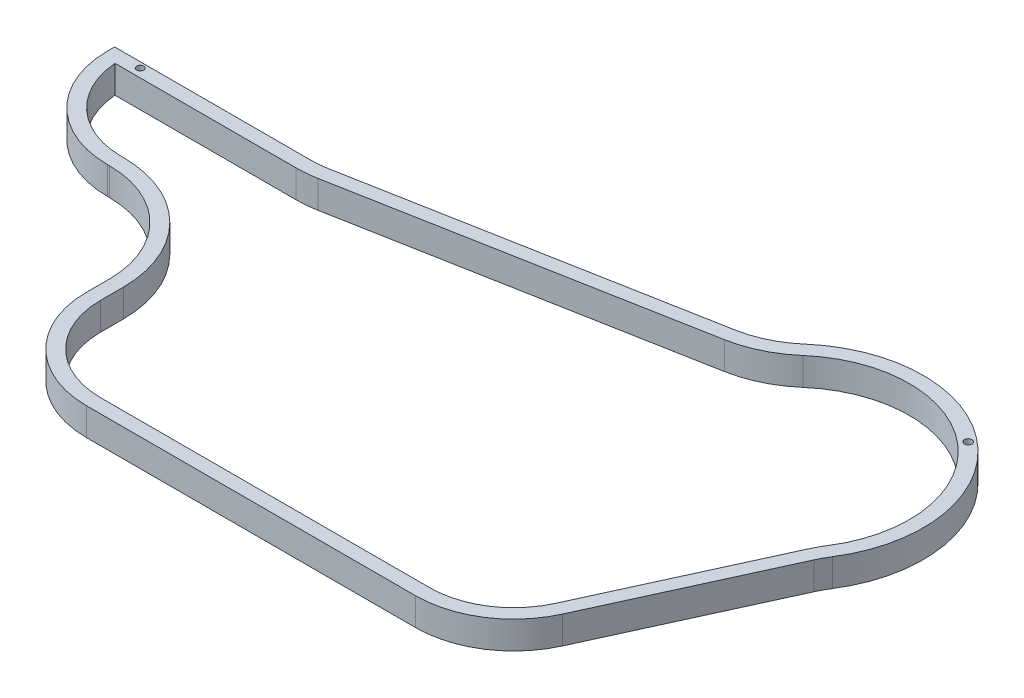
ISO-10303-21;
HEADER;
FILE_DESCRIPTION(('STEP AP214'),'2;1');
FILE_NAME('part.step','',(''),(''),'','','');
FILE_SCHEMA(('AUTOMOTIVE_DESIGN { 1 0 10303 214 1 1 1 1 }'));
ENDSEC;
DATA;
#1=APPLICATION_CONTEXT('core data for automotive mechanical design processes');
#2=APPLICATION_PROTOCOL_DEFINITION('international standard','automotive_design',2000,#1);
#3=PRODUCT_CONTEXT('',#1,'mechanical');
#4=PRODUCT('Part','Part','',(#3));
#5=PRODUCT_RELATED_PRODUCT_CATEGORY('part','',(#4));
#6=PRODUCT_DEFINITION_FORMATION('','',#4);
#7=PRODUCT_DEFINITION_CONTEXT('part definition',#1,'design');
#8=PRODUCT_DEFINITION('design','',#6,#7);
#9=PRODUCT_DEFINITION_SHAPE('','',#8);
#10=(LENGTH_UNIT() NAMED_UNIT(*) SI_UNIT(.MILLI.,.METRE.));
#11=(NAMED_UNIT(*) PLANE_ANGLE_UNIT() SI_UNIT($,.RADIAN.));
#12=(NAMED_UNIT(*) SI_UNIT($,.STERADIAN.) SOLID_ANGLE_UNIT());
#13=UNCERTAINTY_MEASURE_WITH_UNIT(LENGTH_MEASURE(1.E-05),#10,'distance_accuracy_value','');
#14=(GEOMETRIC_REPRESENTATION_CONTEXT(3) GLOBAL_UNCERTAINTY_ASSIGNED_CONTEXT((#13)) GLOBAL_UNIT_ASSIGNED_CONTEXT((#10,
#11,#12)) REPRESENTATION_CONTEXT('',''));
#15=CARTESIAN_POINT('',(0.,0.,0.));
#16=DIRECTION('',(0.,0.,1.));
#17=DIRECTION('',(1.,0.,0.));
#18=AXIS2_PLACEMENT_3D('',#15,#16,#17);
#19=CARTESIAN_POINT('',(-35.8905464193308,5.,-25.0792929292929));
#20=DIRECTION('',(1.,0.,0.));
#21=DIRECTION('',(0.,0.,-1.));
#22=AXIS2_PLACEMENT_3D('',#19,#20,#21);
#23=PLANE('',#22);
#24=DIRECTION('',(0.,0.,1.));
#25=VECTOR('',#24,1.);
#26=CARTESIAN_POINT('',(-35.8905464193308,0.,-25.0792929292929));
#27=LINE('',#26,#25);
#28=CARTESIAN_POINT('',(-35.8905464193308,0.,-25.0792929292929));
#29=VERTEX_POINT('',#28);
#30=CARTESIAN_POINT('',(-35.8905464193308,0.,-23.7772222222223));
#31=VERTEX_POINT('',#30);
#32=EDGE_CURVE('E306',#29,#31,#27,.T.);
#33=ORIENTED_EDGE('',*,*,#32,.T.);
#34=DIRECTION('',(0.,-1.,0.));
#35=VECTOR('',#34,1.);
#36=CARTESIAN_POINT('',(-35.8905464193308,5.,-23.7772222222223));
#37=LINE('',#36,#35);
#38=CARTESIAN_POINT('',(-35.8905464193308,5.,-23.7772222222223));
#39=VERTEX_POINT('',#38);
#40=EDGE_CURVE('E488',#39,#31,#37,.T.);
#41=ORIENTED_EDGE('',*,*,#40,.F.);
#42=DIRECTION('',(0.,0.,1.));
#43=VECTOR('',#42,1.);
#44=CARTESIAN_POINT('',(-35.8905464193308,5.,-25.0792929292929));
#45=LINE('',#44,#43);
#46=CARTESIAN_POINT('',(-35.8905464193308,5.,-25.0792929292929));
#47=VERTEX_POINT('',#46);
#48=EDGE_CURVE('E341',#47,#39,#45,.T.);
#49=ORIENTED_EDGE('',*,*,#48,.F.);
#50=DIRECTION('',(0.,-1.,0.));
#51=VECTOR('',#50,1.);
#52=CARTESIAN_POINT('',(-35.8905464193308,5.,-25.0792929292929));
#53=LINE('',#52,#51);
#54=EDGE_CURVE('E388',#47,#29,#53,.T.);
#55=ORIENTED_EDGE('',*,*,#54,.T.);
#56=EDGE_LOOP('',(#33,#41,#49,#55));
#57=FACE_BOUND('',#56,.T.);
#58=ADVANCED_FACE('F41',(#57),#23,.F.);
#59=CARTESIAN_POINT('',(-18.1105464193308,5.,-23.7772222222222));
#60=DIRECTION('',(0.,-1.,0.));
#61=DIRECTION('',(0.,0.,-1.));
#62=AXIS2_PLACEMENT_3D('',#59,#60,#61);
#63=CYLINDRICAL_SURFACE('',#62,17.78);
#64=CARTESIAN_POINT('',(-18.1105464193308,0.,-23.7772222222222));
#65=DIRECTION('',(0.,1.,0.));
#66=DIRECTION('',(0.,0.,1.));
#67=AXIS2_PLACEMENT_3D('',#64,#65,#66);
#68=CIRCLE('',#67,17.78);
#69=CARTESIAN_POINT('',(-18.1105464193307,0.,-5.99722222222222));
#70=VERTEX_POINT('',#69);
#71=EDGE_CURVE('E392',#31,#70,#68,.T.);
#72=ORIENTED_EDGE('',*,*,#71,.T.);
#73=DIRECTION('',(0.,-1.,0.));
#74=VECTOR('',#73,1.);
#75=CARTESIAN_POINT('',(-18.1105464193307,5.,-5.99722222222222));
#76=LINE('',#75,#74);
#77=CARTESIAN_POINT('',(-18.1105464193307,5.,-5.99722222222222));
#78=VERTEX_POINT('',#77);
#79=EDGE_CURVE('E484',#78,#70,#76,.T.);
#80=ORIENTED_EDGE('',*,*,#79,.F.);
#81=CARTESIAN_POINT('',(-18.1105464193308,5.,-23.7772222222222));
#82=DIRECTION('',(0.,1.,0.));
#83=DIRECTION('',(0.,0.,1.));
#84=AXIS2_PLACEMENT_3D('',#81,#82,#83);
#85=CIRCLE('',#84,17.78);
#86=EDGE_CURVE('E345',#39,#78,#85,.T.);
#87=ORIENTED_EDGE('',*,*,#86,.F.);
#88=ORIENTED_EDGE('',*,*,#40,.T.);
#89=EDGE_LOOP('',(#72,#80,#87,#88));
#90=FACE_BOUND('',#89,.T.);
#91=ADVANCED_FACE('F579',(#90),#63,.T.);
#92=CARTESIAN_POINT('',(-18.1105464193307,5.,-5.99722222222222));
#93=DIRECTION('',(0.,0.,-1.));
#94=DIRECTION('',(-1.,0.,0.));
#95=AXIS2_PLACEMENT_3D('',#92,#93,#94);
#96=PLANE('',#95);
#97=DIRECTION('',(1.,0.,0.));
#98=VECTOR('',#97,1.);
#99=CARTESIAN_POINT('',(-18.1105464193307,0.,-5.99722222222222));
#100=LINE('',#99,#98);
#101=CARTESIAN_POINT('',(-17.7800000000001,0.,-5.99722222222222));
#102=VERTEX_POINT('',#101);
#103=EDGE_CURVE('E395',#70,#102,#100,.T.);
#104=ORIENTED_EDGE('',*,*,#103,.T.);
#105=DIRECTION('',(0.,-1.,0.));
#106=VECTOR('',#105,1.);
#107=CARTESIAN_POINT('',(-17.7800000000001,5.,-5.99722222222222));
#108=LINE('',#107,#106);
#109=CARTESIAN_POINT('',(-17.7800000000001,5.,-5.99722222222222));
#110=VERTEX_POINT('',#109);
#111=EDGE_CURVE('E480',#110,#102,#108,.T.);
#112=ORIENTED_EDGE('',*,*,#111,.F.);
#113=DIRECTION('',(1.,0.,0.));
#114=VECTOR('',#113,1.);
#115=CARTESIAN_POINT('',(-18.1105464193307,5.,-5.99722222222222));
#116=LINE('',#115,#114);
#117=EDGE_CURVE('E349',#78,#110,#116,.T.);
#118=ORIENTED_EDGE('',*,*,#117,.F.);
#119=ORIENTED_EDGE('',*,*,#79,.T.);
#120=EDGE_LOOP('',(#104,#112,#118,#119));
#121=FACE_BOUND('',#120,.T.);
#122=ADVANCED_FACE('F584',(#121),#96,.F.);
#123=CARTESIAN_POINT('',(-17.78,5.,11.7827777777778));
#124=DIRECTION('',(0.,-1.,0.));
#125=DIRECTION('',(0.,0.,-1.));
#126=AXIS2_PLACEMENT_3D('',#123,#124,#125);
#127=CYLINDRICAL_SURFACE('',#126,17.78);
#128=CARTESIAN_POINT('',(-17.78,0.,11.7827777777778));
#129=DIRECTION('',(0.,-1.,0.));
#130=DIRECTION('',(0.,0.,-1.));
#131=AXIS2_PLACEMENT_3D('',#128,#129,#130);
#132=CIRCLE('',#131,17.78);
#133=CARTESIAN_POINT('',(0.,0.,11.7827777777779));
#134=VERTEX_POINT('',#133);
#135=EDGE_CURVE('E398',#102,#134,#132,.T.);
#136=ORIENTED_EDGE('',*,*,#135,.T.);
#137=DIRECTION('',(0.,-1.,0.));
#138=VECTOR('',#137,1.);
#139=CARTESIAN_POINT('',(0.,5.,11.7827777777779));
#140=LINE('',#139,#138);
#141=CARTESIAN_POINT('',(0.,5.,11.7827777777779));
#142=VERTEX_POINT('',#141);
#143=EDGE_CURVE('E476',#142,#134,#140,.T.);
#144=ORIENTED_EDGE('',*,*,#143,.F.);
#145=CARTESIAN_POINT('',(-17.78,5.,11.7827777777778));
#146=DIRECTION('',(0.,-1.,0.));
#147=DIRECTION('',(0.,0.,-1.));
#148=AXIS2_PLACEMENT_3D('',#145,#146,#147);
#149=CIRCLE('',#148,17.78);
#150=EDGE_CURVE('E352',#110,#142,#149,.T.);
#151=ORIENTED_EDGE('',*,*,#150,.F.);
#152=ORIENTED_EDGE('',*,*,#111,.T.);
#153=EDGE_LOOP('',(#136,#144,#151,#152));
#154=FACE_BOUND('',#153,.T.);
#155=ADVANCED_FACE('F648',(#154),#127,.F.);
#156=CARTESIAN_POINT('',(0.,5.,11.7827777777779));
#157=DIRECTION('',(1.,0.,0.));
#158=DIRECTION('',(0.,0.,-1.));
#159=AXIS2_PLACEMENT_3D('',#156,#157,#158);
#160=PLANE('',#159);
#161=DIRECTION('',(0.,0.,1.));
#162=VECTOR('',#161,1.);
#163=CARTESIAN_POINT('',(0.,0.,11.7827777777779));
#164=LINE('',#163,#162);
#165=CARTESIAN_POINT('',(0.,0.,15.9134848484847));
#166=VERTEX_POINT('',#165);
#167=EDGE_CURVE('E401',#134,#166,#164,.T.);
#168=ORIENTED_EDGE('',*,*,#167,.T.);
#169=DIRECTION('',(0.,-1.,0.));
#170=VECTOR('',#169,1.);
#171=CARTESIAN_POINT('',(0.,5.,15.9134848484847));
#172=LINE('',#171,#170);
#173=CARTESIAN_POINT('',(0.,5.,15.9134848484847));
#174=VERTEX_POINT('',#173);
#175=EDGE_CURVE('E472',#174,#166,#172,.T.);
#176=ORIENTED_EDGE('',*,*,#175,.F.);
#177=DIRECTION('',(0.,0.,1.));
#178=VECTOR('',#177,1.);
#179=CARTESIAN_POINT('',(0.,5.,11.7827777777779));
#180=LINE('',#179,#178);
#181=EDGE_CURVE('E355',#142,#174,#180,.T.);
#182=ORIENTED_EDGE('',*,*,#181,.F.);
#183=ORIENTED_EDGE('',*,*,#143,.T.);
#184=EDGE_LOOP('',(#168,#176,#182,#183));
#185=FACE_BOUND('',#184,.T.);
#186=ADVANCED_FACE('F645',(#185),#160,.F.);
#187=CARTESIAN_POINT('',(17.78,5.,15.9134848484849));
#188=DIRECTION('',(0.,-1.,0.));
#189=DIRECTION('',(0.,0.,-1.));
#190=AXIS2_PLACEMENT_3D('',#187,#188,#189);
#191=CYLINDRICAL_SURFACE('',#190,17.78);
#192=CARTESIAN_POINT('',(17.78,0.,15.9134848484849));
#193=DIRECTION('',(0.,1.,0.));
#194=DIRECTION('',(0.,0.,1.));
#195=AXIS2_PLACEMENT_3D('',#192,#193,#194);
#196=CIRCLE('',#195,17.78);
#197=CARTESIAN_POINT('',(17.7800000000001,0.,33.6934848484849));
#198=VERTEX_POINT('',#197);
#199=EDGE_CURVE('E404',#166,#198,#196,.T.);
#200=ORIENTED_EDGE('',*,*,#199,.T.);
#201=DIRECTION('',(0.,-1.,0.));
#202=VECTOR('',#201,1.);
#203=CARTESIAN_POINT('',(17.7800000000001,5.,33.6934848484849));
#204=LINE('',#203,#202);
#205=CARTESIAN_POINT('',(17.7800000000001,5.,33.6934848484849));
#206=VERTEX_POINT('',#205);
#207=EDGE_CURVE('E468',#206,#198,#204,.T.);
#208=ORIENTED_EDGE('',*,*,#207,.F.);
#209=CARTESIAN_POINT('',(17.78,5.,15.9134848484849));
#210=DIRECTION('',(0.,1.,0.));
#211=DIRECTION('',(0.,0.,1.));
#212=AXIS2_PLACEMENT_3D('',#209,#210,#211);
#213=CIRCLE('',#212,17.78);
#214=EDGE_CURVE('E358',#174,#206,#213,.T.);
#215=ORIENTED_EDGE('',*,*,#214,.F.);
#216=ORIENTED_EDGE('',*,*,#175,.T.);
#217=EDGE_LOOP('',(#200,#208,#215,#216));
#218=FACE_BOUND('',#217,.T.);
#219=ADVANCED_FACE('F641',(#218),#191,.T.);
#220=CARTESIAN_POINT('',(17.7800000000001,5.,33.6934848484849));
#221=DIRECTION('',(0.,0.,-1.));
#222=DIRECTION('',(-1.,0.,0.));
#223=AXIS2_PLACEMENT_3D('',#220,#221,#222);
#224=PLANE('',#223);
#225=DIRECTION('',(1.,0.,0.));
#226=VECTOR('',#225,1.);
#227=CARTESIAN_POINT('',(17.7800000000001,0.,33.6934848484849));
#228=LINE('',#227,#226);
#229=CARTESIAN_POINT('',(77.3126722678152,0.,33.6934848484849));
#230=VERTEX_POINT('',#229);
#231=EDGE_CURVE('E407',#198,#230,#228,.T.);
#232=ORIENTED_EDGE('',*,*,#231,.T.);
#233=DIRECTION('',(0.,-1.,0.));
#234=VECTOR('',#233,1.);
#235=CARTESIAN_POINT('',(77.3126722678152,5.,33.6934848484849));
#236=LINE('',#235,#234);
#237=CARTESIAN_POINT('',(77.3126722678152,5.,33.6934848484849));
#238=VERTEX_POINT('',#237);
#239=EDGE_CURVE('E464',#238,#230,#236,.T.);
#240=ORIENTED_EDGE('',*,*,#239,.F.);
#241=DIRECTION('',(1.,0.,0.));
#242=VECTOR('',#241,1.);
#243=CARTESIAN_POINT('',(17.7800000000001,5.,33.6934848484849));
#244=LINE('',#243,#242);
#245=EDGE_CURVE('E361',#206,#238,#244,.T.);
#246=ORIENTED_EDGE('',*,*,#245,.F.);
#247=ORIENTED_EDGE('',*,*,#207,.T.);
#248=EDGE_LOOP('',(#232,#240,#246,#247));
#249=FACE_BOUND('',#248,.T.);
#250=ADVANCED_FACE('F636',(#249),#224,.F.);
#251=CARTESIAN_POINT('',(77.3126722678153,5.,15.9134848484848));
#252=DIRECTION('',(0.,-1.,0.));
#253=DIRECTION('',(0.,0.,-1.));
#254=AXIS2_PLACEMENT_3D('',#251,#252,#253);
#255=CYLINDRICAL_SURFACE('',#254,17.78);
#256=CARTESIAN_POINT('',(77.3126722678153,0.,15.9134848484848));
#257=DIRECTION('',(0.,1.,0.));
#258=DIRECTION('',(0.,0.,1.));
#259=AXIS2_PLACEMENT_3D('',#256,#257,#258);
#260=CIRCLE('',#259,17.78);
#261=CARTESIAN_POINT('',(93.4879574655916,0.,23.2951207627384));
#262=VERTEX_POINT('',#261);
#263=EDGE_CURVE('E410',#230,#262,#260,.T.);
#264=ORIENTED_EDGE('',*,*,#263,.T.);
#265=DIRECTION('',(0.,-1.,0.));
#266=VECTOR('',#265,1.);
#267=CARTESIAN_POINT('',(93.4879574655916,5.,23.2951207627384));
#268=LINE('',#267,#266);
#269=CARTESIAN_POINT('',(93.4879574655916,5.,23.2951207627384));
#270=VERTEX_POINT('',#269);
#271=EDGE_CURVE('E460',#270,#262,#268,.T.);
#272=ORIENTED_EDGE('',*,*,#271,.F.);
#273=CARTESIAN_POINT('',(77.3126722678153,5.,15.9134848484848));
#274=DIRECTION('',(0.,1.,0.));
#275=DIRECTION('',(0.,0.,1.));
#276=AXIS2_PLACEMENT_3D('',#273,#274,#275);
#277=CIRCLE('',#276,17.78);
#278=EDGE_CURVE('E364',#238,#270,#277,.T.);
#279=ORIENTED_EDGE('',*,*,#278,.F.);
#280=ORIENTED_EDGE('',*,*,#239,.T.);
#281=EDGE_LOOP('',(#264,#272,#279,#280));
#282=FACE_BOUND('',#281,.T.);
#283=ADVANCED_FACE('F630',(#282),#255,.T.);
#284=CARTESIAN_POINT('',(93.4879574655916,5.,23.2951207627384));
#285=DIRECTION('',(-0.909746074115652,0.,-0.415165124536201));
#286=DIRECTION('',(-0.415165124536201,0.,0.909746074115652));
#287=AXIS2_PLACEMENT_3D('',#284,#285,#286);
#288=PLANE('',#287);
#289=DIRECTION('',(0.415165124536201,0.,-0.909746074115652));
#290=VECTOR('',#289,1.);
#291=CARTESIAN_POINT('',(93.4879574655916,0.,23.2951207627384));
#292=LINE('',#291,#290);
#293=CARTESIAN_POINT('',(107.768626914468,0.,-7.99792915654823));
#294=VERTEX_POINT('',#293);
#295=EDGE_CURVE('E413',#262,#294,#292,.T.);
#296=ORIENTED_EDGE('',*,*,#295,.T.);
#297=DIRECTION('',(0.,-1.,0.));
#298=VECTOR('',#297,1.);
#299=CARTESIAN_POINT('',(107.768626914468,5.,-7.99792915654823));
#300=LINE('',#299,#298);
#301=CARTESIAN_POINT('',(107.768626914468,5.,-7.99792915654823));
#302=VERTEX_POINT('',#301);
#303=EDGE_CURVE('E456',#302,#294,#300,.T.);
#304=ORIENTED_EDGE('',*,*,#303,.F.);
#305=DIRECTION('',(0.415165124536201,0.,-0.909746074115652));
#306=VECTOR('',#305,1.);
#307=CARTESIAN_POINT('',(93.4879574655916,5.,23.2951207627384));
#308=LINE('',#307,#306);
#309=EDGE_CURVE('E367',#270,#302,#308,.T.);
#310=ORIENTED_EDGE('',*,*,#309,.F.);
#311=ORIENTED_EDGE('',*,*,#271,.T.);
#312=EDGE_LOOP('',(#296,#304,#310,#311));
#313=FACE_BOUND('',#312,.T.);
#314=ADVANCED_FACE('F626',(#313),#288,.F.);
#315=CARTESIAN_POINT('',(123.943912112244,5.,-0.616293242294591));
#316=DIRECTION('',(0.,-1.,0.));
#317=DIRECTION('',(0.,0.,-1.));
#318=AXIS2_PLACEMENT_3D('',#315,#316,#317);
#319=CYLINDRICAL_SURFACE('',#318,17.78);
#320=CARTESIAN_POINT('',(123.943912112244,0.,-0.616293242294591));
#321=DIRECTION('',(0.,-1.,0.));
#322=DIRECTION('',(0.,0.,-1.));
#323=AXIS2_PLACEMENT_3D('',#320,#321,#322);
#324=CIRCLE('',#323,17.78);
#325=CARTESIAN_POINT('',(108.920724008926,0.,-10.1258788911188));
#326=VERTEX_POINT('',#325);
#327=EDGE_CURVE('E416',#294,#326,#324,.T.);
#328=ORIENTED_EDGE('',*,*,#327,.T.);
#329=DIRECTION('',(0.,-1.,0.));
#330=VECTOR('',#329,1.);
#331=CARTESIAN_POINT('',(108.920724008926,5.,-10.1258788911188));
#332=LINE('',#331,#330);
#333=CARTESIAN_POINT('',(108.920724008926,5.,-10.1258788911188));
#334=VERTEX_POINT('',#333);
#335=EDGE_CURVE('E452',#334,#326,#332,.T.);
#336=ORIENTED_EDGE('',*,*,#335,.F.);
#337=CARTESIAN_POINT('',(123.943912112244,5.,-0.616293242294591));
#338=DIRECTION('',(0.,-1.,0.));
#339=DIRECTION('',(0.,0.,-1.));
#340=AXIS2_PLACEMENT_3D('',#337,#338,#339);
#341=CIRCLE('',#340,17.78);
#342=EDGE_CURVE('E370',#302,#334,#341,.T.);
#343=ORIENTED_EDGE('',*,*,#342,.F.);
#344=ORIENTED_EDGE('',*,*,#303,.T.);
#345=EDGE_LOOP('',(#328,#336,#343,#344));
#346=FACE_BOUND('',#345,.T.);
#347=ADVANCED_FACE('F621',(#346),#319,.F.);
#348=CARTESIAN_POINT('',(88.742635398851,5.,-22.8984848484848));
#349=DIRECTION('',(0.,-1.,0.));
#350=DIRECTION('',(0.,0.,-1.));
#351=AXIS2_PLACEMENT_3D('',#348,#349,#350);
#352=CYLINDRICAL_SURFACE('',#351,23.8808442668632);
#353=CARTESIAN_POINT('',(88.742635398851,0.,-22.8984848484848));
#354=DIRECTION('',(0.,1.,0.));
#355=DIRECTION('',(0.,0.,1.));
#356=AXIS2_PLACEMENT_3D('',#353,#354,#355);
#357=CIRCLE('',#356,23.8808442668632);
#358=CARTESIAN_POINT('',(73.0806125803181,0.,-40.926123743524));
#359=VERTEX_POINT('',#358);
#360=EDGE_CURVE('E419',#326,#359,#357,.T.);
#361=ORIENTED_EDGE('',*,*,#360,.T.);
#362=DIRECTION('',(0.,-1.,0.));
#363=VECTOR('',#362,1.);
#364=CARTESIAN_POINT('',(73.0806125803181,5.,-40.926123743524));
#365=LINE('',#364,#363);
#366=CARTESIAN_POINT('',(73.0806125803181,5.,-40.926123743524));
#367=VERTEX_POINT('',#366);
#368=EDGE_CURVE('E448',#367,#359,#365,.T.);
#369=ORIENTED_EDGE('',*,*,#368,.F.);
#370=CARTESIAN_POINT('',(88.742635398851,5.,-22.8984848484848));
#371=DIRECTION('',(0.,1.,0.));
#372=DIRECTION('',(0.,0.,1.));
#373=AXIS2_PLACEMENT_3D('',#370,#371,#372);
#374=CIRCLE('',#373,23.8808442668632);
#375=EDGE_CURVE('E373',#334,#367,#374,.T.);
#376=ORIENTED_EDGE('',*,*,#375,.F.);
#377=ORIENTED_EDGE('',*,*,#335,.T.);
#378=EDGE_LOOP('',(#361,#369,#376,#377));
#379=FACE_BOUND('',#378,.T.);
#380=ADVANCED_FACE('F615',(#379),#352,.T.);
#381=CARTESIAN_POINT('',(61.4197699986378,5.,-54.3482379691321));
#382=DIRECTION('',(0.,-1.,0.));
#383=DIRECTION('',(0.,0.,-1.));
#384=AXIS2_PLACEMENT_3D('',#381,#382,#383);
#385=CYLINDRICAL_SURFACE('',#384,17.78);
#386=CARTESIAN_POINT('',(61.4197699986378,0.,-54.3482379691321));
#387=DIRECTION('',(0.,-1.,0.));
#388=DIRECTION('',(0.,0.,1.));
#389=AXIS2_PLACEMENT_3D('',#386,#387,#388);
#390=CIRCLE('',#389,17.78);
#391=CARTESIAN_POINT('',(64.6603821224373,0.,-36.8660518054086));
#392=VERTEX_POINT('',#391);
#393=EDGE_CURVE('E422',#359,#392,#390,.T.);
#394=ORIENTED_EDGE('',*,*,#393,.T.);
#395=DIRECTION('',(0.,-1.,0.));
#396=VECTOR('',#395,1.);
#397=CARTESIAN_POINT('',(64.6603821224373,5.,-36.8660518054086));
#398=LINE('',#397,#396);
#399=CARTESIAN_POINT('',(64.6603821224373,5.,-36.8660518054086));
#400=VERTEX_POINT('',#399);
#401=EDGE_CURVE('E444',#400,#392,#398,.T.);
#402=ORIENTED_EDGE('',*,*,#401,.F.);
#403=CARTESIAN_POINT('',(61.4197699986378,5.,-54.3482379691321));
#404=DIRECTION('',(0.,-1.,0.));
#405=DIRECTION('',(0.,0.,1.));
#406=AXIS2_PLACEMENT_3D('',#403,#404,#405);
#407=CIRCLE('',#406,17.78);
#408=EDGE_CURVE('E376',#367,#400,#407,.T.);
#409=ORIENTED_EDGE('',*,*,#408,.F.);
#410=ORIENTED_EDGE('',*,*,#368,.T.);
#411=EDGE_LOOP('',(#394,#402,#409,#410));
#412=FACE_BOUND('',#411,.T.);
#413=ADVANCED_FACE('F611',(#412),#385,.F.);
#414=CARTESIAN_POINT('',(2.6807719937912,5.,-25.3771067655695));
#415=DIRECTION('',(0.182261649257563,0.,0.983250065451263));
#416=DIRECTION('',(0.983250065451263,0.,-0.182261649257563));
#417=AXIS2_PLACEMENT_3D('',#414,#415,#416);
#418=PLANE('',#417);
#419=DIRECTION('',(-0.983250065451263,0.,0.182261649257563));
#420=VECTOR('',#419,1.);
#421=CARTESIAN_POINT('',(2.6807719937912,0.,-25.3771067655695));
#422=LINE('',#421,#420);
#423=CARTESIAN_POINT('',(2.6807719937912,0.,-25.3771067655695));
#424=VERTEX_POINT('',#423);
#425=EDGE_CURVE('E425',#392,#424,#422,.T.);
#426=ORIENTED_EDGE('',*,*,#425,.T.);
#427=DIRECTION('',(0.,-1.,0.));
#428=VECTOR('',#427,1.);
#429=CARTESIAN_POINT('',(2.6807719937912,5.,-25.3771067655695));
#430=LINE('',#429,#428);
#431=CARTESIAN_POINT('',(2.6807719937912,5.,-25.3771067655695));
#432=VERTEX_POINT('',#431);
#433=EDGE_CURVE('E440',#432,#424,#430,.T.);
#434=ORIENTED_EDGE('',*,*,#433,.F.);
#435=DIRECTION('',(-0.983250065451263,0.,0.182261649257563));
#436=VECTOR('',#435,1.);
#437=CARTESIAN_POINT('',(2.6807719937912,5.,-25.3771067655695));
#438=LINE('',#437,#436);
#439=EDGE_CURVE('E379',#400,#432,#438,.T.);
#440=ORIENTED_EDGE('',*,*,#439,.F.);
#441=ORIENTED_EDGE('',*,*,#401,.T.);
#442=EDGE_LOOP('',(#426,#434,#440,#441));
#443=FACE_BOUND('',#442,.T.);
#444=ADVANCED_FACE('F606',(#443),#418,.F.);
#445=CARTESIAN_POINT('',(-0.559840130008328,5.,-42.8592929292929));
#446=DIRECTION('',(0.,-1.,0.));
#447=DIRECTION('',(0.,0.,-1.));
#448=AXIS2_PLACEMENT_3D('',#445,#446,#447);
#449=CYLINDRICAL_SURFACE('',#448,17.78);
#450=CARTESIAN_POINT('',(-0.559840130008328,0.,-42.8592929292929));
#451=DIRECTION('',(0.,-1.,0.));
#452=DIRECTION('',(0.,0.,1.));
#453=AXIS2_PLACEMENT_3D('',#450,#451,#452);
#454=CIRCLE('',#453,17.78);
#455=CARTESIAN_POINT('',(-0.559840130008393,0.,-25.0792929292929));
#456=VERTEX_POINT('',#455);
#457=EDGE_CURVE('E428',#424,#456,#454,.T.);
#458=ORIENTED_EDGE('',*,*,#457,.T.);
#459=DIRECTION('',(0.,-1.,0.));
#460=VECTOR('',#459,1.);
#461=CARTESIAN_POINT('',(-0.559840130008393,5.,-25.0792929292929));
#462=LINE('',#461,#460);
#463=CARTESIAN_POINT('',(-0.559840130008393,5.,-25.0792929292929));
#464=VERTEX_POINT('',#463);
#465=EDGE_CURVE('E436',#464,#456,#462,.T.);
#466=ORIENTED_EDGE('',*,*,#465,.F.);
#467=CARTESIAN_POINT('',(-0.559840130008328,5.,-42.8592929292929));
#468=DIRECTION('',(0.,-1.,0.));
#469=DIRECTION('',(0.,0.,1.));
#470=AXIS2_PLACEMENT_3D('',#467,#468,#469);
#471=CIRCLE('',#470,17.78);
#472=EDGE_CURVE('E382',#432,#464,#471,.T.);
#473=ORIENTED_EDGE('',*,*,#472,.F.);
#474=ORIENTED_EDGE('',*,*,#433,.T.);
#475=EDGE_LOOP('',(#458,#466,#473,#474));
#476=FACE_BOUND('',#475,.T.);
#477=ADVANCED_FACE('F574',(#476),#449,.F.);
#478=CARTESIAN_POINT('',(-0.559840130008393,5.,-25.0792929292929));
#479=DIRECTION('',(0.,0.,1.));
#480=DIRECTION('',(1.,0.,0.));
#481=AXIS2_PLACEMENT_3D('',#478,#479,#480);
#482=PLANE('',#481);
#483=DIRECTION('',(-1.,0.,0.));
#484=VECTOR('',#483,1.);
#485=CARTESIAN_POINT('',(-0.559840130008393,0.,-25.0792929292929));
#486=LINE('',#485,#484);
#487=EDGE_CURVE('E346',#456,#29,#486,.T.);
#488=ORIENTED_EDGE('',*,*,#487,.T.);
#489=ORIENTED_EDGE('',*,*,#54,.F.);
#490=DIRECTION('',(-1.,0.,0.));
#491=VECTOR('',#490,1.);
#492=CARTESIAN_POINT('',(-0.559840130008393,5.,-25.0792929292929));
#493=LINE('',#492,#491);
#494=EDGE_CURVE('E385',#464,#47,#493,.T.);
#495=ORIENTED_EDGE('',*,*,#494,.F.);
#496=ORIENTED_EDGE('',*,*,#465,.T.);
#497=EDGE_LOOP('',(#488,#489,#495,#496));
#498=FACE_BOUND('',#497,.T.);
#499=ADVANCED_FACE('F564',(#498),#482,.F.);
#500=CARTESIAN_POINT('',(-18.1105464193308,5.,-23.7772222222222));
#501=DIRECTION('',(0.,1.,0.));
#502=DIRECTION('',(0.,0.,1.));
#503=AXIS2_PLACEMENT_3D('',#500,#501,#502);
#504=PLANE('',#503);
#505=CARTESIAN_POINT('',(-30.2611554990854,5.,-24.0771946130235));
#506=DIRECTION('',(0.,1.,0.));
#507=DIRECTION('',(0.,0.,1.));
#508=AXIS2_PLACEMENT_3D('',#505,#506,#507);
#509=CIRCLE('',#508,0.6408523022046);
#510=CARTESIAN_POINT('',(-30.2611554990854,5.,-23.4363423108189));
#511=VERTEX_POINT('',#510);
#512=EDGE_CURVE('E542',#511,#511,#509,.T.);
#513=ORIENTED_EDGE('',*,*,#512,.F.);
#514=EDGE_LOOP('',(#513));
#515=FACE_BOUND('',#514,.T.);
#516=CARTESIAN_POINT('',(103.209357624923,5.,-40.4267224254829));
#517=DIRECTION('',(0.,1.,0.));
#518=DIRECTION('',(0.,0.,1.));
#519=AXIS2_PLACEMENT_3D('',#516,#517,#518);
#520=CIRCLE('',#519,0.683244837720799);
#521=CARTESIAN_POINT('',(103.209357624923,5.,-39.7434775877621));
#522=VERTEX_POINT('',#521);
#523=EDGE_CURVE('E549',#522,#522,#520,.T.);
#524=ORIENTED_EDGE('',*,*,#523,.F.);
#525=EDGE_LOOP('',(#524));
#526=FACE_BOUND('',#525,.T.);
#527=CARTESIAN_POINT('',(-18.1105464193308,5.,-23.7772222222222));
#528=DIRECTION('',(0.,1.,0.));
#529=DIRECTION('',(0.,0.,1.));
#530=AXIS2_PLACEMENT_3D('',#527,#528,#529);
#531=CIRCLE('',#530,15.24);
#532=CARTESIAN_POINT('',(-33.3001853572946,5.,-22.5392929292929));
#533=VERTEX_POINT('',#532);
#534=CARTESIAN_POINT('',(-18.1105464193307,5.,-8.53722222222222));
#535=VERTEX_POINT('',#534);
#536=EDGE_CURVE('E58',#533,#535,#531,.T.);
#537=ORIENTED_EDGE('',*,*,#536,.F.);
#538=DIRECTION('',(-1.,0.,0.));
#539=VECTOR('',#538,1.);
#540=CARTESIAN_POINT('',(-0.559840130008396,5.,-22.5392929292929));
#541=LINE('',#540,#539);
#542=CARTESIAN_POINT('',(-0.559840130008396,5.,-22.5392929292929));
#543=VERTEX_POINT('',#542);
#544=EDGE_CURVE('E299',#543,#533,#541,.T.);
#545=ORIENTED_EDGE('',*,*,#544,.F.);
#546=CARTESIAN_POINT('',(-0.559840130008328,5.,-42.8592929292929));
#547=DIRECTION('',(0.,-1.,0.));
#548=DIRECTION('',(0.,0.,1.));
#549=AXIS2_PLACEMENT_3D('',#546,#547,#548);
#550=CIRCLE('',#549,20.32);
#551=CARTESIAN_POINT('',(3.14371658290538,5.,-22.8796515993233));
#552=VERTEX_POINT('',#551);
#553=EDGE_CURVE('E295',#552,#543,#550,.T.);
#554=ORIENTED_EDGE('',*,*,#553,.F.);
#555=DIRECTION('',(-0.983250065451263,0.,0.182261649257563));
#556=VECTOR('',#555,1.);
#557=CARTESIAN_POINT('',(65.1233267115515,5.,-34.3685966391624));
#558=LINE('',#557,#556);
#559=CARTESIAN_POINT('',(65.1233267115515,5.,-34.3685966391624));
#560=VERTEX_POINT('',#559);
#561=EDGE_CURVE('E291',#560,#552,#558,.T.);
#562=ORIENTED_EDGE('',*,*,#561,.F.);
#563=CARTESIAN_POINT('',(61.4197699986378,5.,-54.3482379691321));
#564=DIRECTION('',(0.,-1.,0.));
#565=DIRECTION('',(0.,0.,1.));
#566=AXIS2_PLACEMENT_3D('',#563,#564,#565);
#567=CIRCLE('',#566,20.32);
#568=CARTESIAN_POINT('',(74.7464472348438,5.,-39.0086788541514));
#569=VERTEX_POINT('',#568);
#570=EDGE_CURVE('E287',#569,#560,#567,.T.);
#571=ORIENTED_EDGE('',*,*,#570,.F.);
#572=CARTESIAN_POINT('',(88.742635398851,5.,-22.8984848484848));
#573=DIRECTION('',(0.,1.,0.));
#574=DIRECTION('',(0.,0.,1.));
#575=AXIS2_PLACEMENT_3D('',#572,#573,#574);
#576=CIRCLE('',#575,21.3408442668632);
#577=CARTESIAN_POINT('',(106.77455427988,5.,-11.4843911266651));
#578=VERTEX_POINT('',#577);
#579=EDGE_CURVE('E283',#578,#569,#576,.T.);
#580=ORIENTED_EDGE('',*,*,#579,.F.);
#581=CARTESIAN_POINT('',(123.943912112244,5.,-0.616293242294591));
#582=DIRECTION('',(0.,-1.,0.));
#583=DIRECTION('',(0.,0.,1.));
#584=AXIS2_PLACEMENT_3D('',#581,#582,#583);
#585=CIRCLE('',#584,20.32);
#586=CARTESIAN_POINT('',(105.457871886214,5.,-9.05244857287019));
#587=VERTEX_POINT('',#586);
#588=EDGE_CURVE('E279',#587,#578,#585,.T.);
#589=ORIENTED_EDGE('',*,*,#588,.F.);
#590=DIRECTION('',(0.415165124536201,0.,-0.909746074115652));
#591=VECTOR('',#590,1.);
#592=CARTESIAN_POINT('',(91.1772024373379,5.,22.2406013464165));
#593=LINE('',#592,#591);
#594=CARTESIAN_POINT('',(91.1772024373379,5.,22.2406013464165));
#595=VERTEX_POINT('',#594);
#596=EDGE_CURVE('E275',#595,#587,#593,.T.);
#597=ORIENTED_EDGE('',*,*,#596,.F.);
#598=CARTESIAN_POINT('',(77.3126722678153,5.,15.9134848484848));
#599=DIRECTION('',(0.,1.,0.));
#600=DIRECTION('',(0.,0.,1.));
#601=AXIS2_PLACEMENT_3D('',#598,#599,#600);
#602=CIRCLE('',#601,15.24);
#603=CARTESIAN_POINT('',(77.3126722678152,5.,31.1534848484848));
#604=VERTEX_POINT('',#603);
#605=EDGE_CURVE('E271',#604,#595,#602,.T.);
#606=ORIENTED_EDGE('',*,*,#605,.F.);
#607=DIRECTION('',(1.,0.,0.));
#608=VECTOR('',#607,1.);
#609=CARTESIAN_POINT('',(17.7800000000001,5.,31.1534848484848));
#610=LINE('',#609,#608);
#611=CARTESIAN_POINT('',(17.7800000000001,5.,31.1534848484848));
#612=VERTEX_POINT('',#611);
#613=EDGE_CURVE('E267',#612,#604,#610,.T.);
#614=ORIENTED_EDGE('',*,*,#613,.F.);
#615=CARTESIAN_POINT('',(17.78,5.,15.9134848484849));
#616=DIRECTION('',(0.,1.,0.));
#617=DIRECTION('',(0.,0.,1.));
#618=AXIS2_PLACEMENT_3D('',#615,#616,#617);
#619=CIRCLE('',#618,15.24);
#620=CARTESIAN_POINT('',(2.54,5.,15.9134848484847));
#621=VERTEX_POINT('',#620);
#622=EDGE_CURVE('E260',#621,#612,#619,.T.);
#623=ORIENTED_EDGE('',*,*,#622,.F.);
#624=DIRECTION('',(0.,0.,1.));
#625=VECTOR('',#624,1.);
#626=CARTESIAN_POINT('',(2.54,5.,11.7827777777779));
#627=LINE('',#626,#625);
#628=CARTESIAN_POINT('',(2.54,5.,11.7827777777779));
#629=VERTEX_POINT('',#628);
#630=EDGE_CURVE('E256',#629,#621,#627,.T.);
#631=ORIENTED_EDGE('',*,*,#630,.F.);
#632=CARTESIAN_POINT('',(-17.78,5.,11.7827777777778));
#633=DIRECTION('',(0.,-1.,0.));
#634=DIRECTION('',(0.,0.,1.));
#635=AXIS2_PLACEMENT_3D('',#632,#633,#634);
#636=CIRCLE('',#635,20.32);
#637=CARTESIAN_POINT('',(-17.7800000000001,5.,-8.53722222222222));
#638=VERTEX_POINT('',#637);
#639=EDGE_CURVE('E237',#638,#629,#636,.T.);
#640=ORIENTED_EDGE('',*,*,#639,.F.);
#641=DIRECTION('',(1.,0.,0.));
#642=VECTOR('',#641,1.);
#643=CARTESIAN_POINT('',(-18.1105464193307,5.,-8.53722222222222));
#644=LINE('',#643,#642);
#645=EDGE_CURVE('E247',#535,#638,#644,.T.);
#646=ORIENTED_EDGE('',*,*,#645,.F.);
#647=EDGE_LOOP('',(#537,#545,#554,#562,#571,#580,#589,#597,#606,#614,#623,#631,#640,#646));
#648=FACE_BOUND('',#647,.T.);
#649=ORIENTED_EDGE('',*,*,#48,.T.);
#650=ORIENTED_EDGE('',*,*,#86,.T.);
#651=ORIENTED_EDGE('',*,*,#117,.T.);
#652=ORIENTED_EDGE('',*,*,#150,.T.);
#653=ORIENTED_EDGE('',*,*,#181,.T.);
#654=ORIENTED_EDGE('',*,*,#214,.T.);
#655=ORIENTED_EDGE('',*,*,#245,.T.);
#656=ORIENTED_EDGE('',*,*,#278,.T.);
#657=ORIENTED_EDGE('',*,*,#309,.T.);
#658=ORIENTED_EDGE('',*,*,#342,.T.);
#659=ORIENTED_EDGE('',*,*,#375,.T.);
#660=ORIENTED_EDGE('',*,*,#408,.T.);
#661=ORIENTED_EDGE('',*,*,#439,.T.);
#662=ORIENTED_EDGE('',*,*,#472,.T.);
#663=ORIENTED_EDGE('',*,*,#494,.T.);
#664=EDGE_LOOP('',(#649,#650,#651,#652,#653,#654,#655,#656,#657,#658,#659,#660,#661,#662,#663));
#665=FACE_BOUND('',#664,.T.);
#666=ADVANCED_FACE('F252',(#515,#526,#648,#665),#504,.T.);
#667=CARTESIAN_POINT('',(-18.1105464193308,0.,-23.7772222222222));
#668=DIRECTION('',(0.,1.,0.));
#669=DIRECTION('',(0.,0.,1.));
#670=AXIS2_PLACEMENT_3D('',#667,#668,#669);
#671=PLANE('',#670);
#672=CARTESIAN_POINT('',(-30.2611554990854,0.,-24.0771946130235));
#673=DIRECTION('',(0.,1.,0.));
#674=DIRECTION('',(0.,0.,1.));
#675=AXIS2_PLACEMENT_3D('',#672,#673,#674);
#676=CIRCLE('',#675,0.6408523022046);
#677=CARTESIAN_POINT('',(-30.2611554990854,0.,-23.4363423108189));
#678=VERTEX_POINT('',#677);
#679=EDGE_CURVE('E44',#678,#678,#676,.T.);
#680=ORIENTED_EDGE('',*,*,#679,.T.);
#681=EDGE_LOOP('',(#680));
#682=FACE_BOUND('',#681,.T.);
#683=CARTESIAN_POINT('',(103.209357624923,0.,-40.4267224254829));
#684=DIRECTION('',(0.,1.,0.));
#685=DIRECTION('',(0.,0.,1.));
#686=AXIS2_PLACEMENT_3D('',#683,#684,#685);
#687=CIRCLE('',#686,0.683244837720799);
#688=CARTESIAN_POINT('',(103.209357624923,0.,-39.7434775877621));
#689=VERTEX_POINT('',#688);
#690=EDGE_CURVE('E539',#689,#689,#687,.T.);
#691=ORIENTED_EDGE('',*,*,#690,.T.);
#692=EDGE_LOOP('',(#691));
#693=FACE_BOUND('',#692,.T.);
#694=DIRECTION('',(-1.,0.,0.));
#695=VECTOR('',#694,1.);
#696=CARTESIAN_POINT('',(-18.1105464193308,0.,-22.5392929292929));
#697=LINE('',#696,#695);
#698=CARTESIAN_POINT('',(-0.559840130008396,0.,-22.5392929292929));
#699=VERTEX_POINT('',#698);
#700=CARTESIAN_POINT('',(-33.3001853572946,0.,-22.5392929292929));
#701=VERTEX_POINT('',#700);
#702=EDGE_CURVE('E50',#699,#701,#697,.T.);
#703=ORIENTED_EDGE('',*,*,#702,.T.);
#704=CARTESIAN_POINT('',(-18.1105464193308,0.,-23.7772222222222));
#705=DIRECTION('',(0.,1.,0.));
#706=DIRECTION('',(0.,0.,1.));
#707=AXIS2_PLACEMENT_3D('',#704,#705,#706);
#708=CIRCLE('',#707,15.24);
#709=CARTESIAN_POINT('',(-18.1105464193307,0.,-8.53722222222222));
#710=VERTEX_POINT('',#709);
#711=EDGE_CURVE('E11',#701,#710,#708,.T.);
#712=ORIENTED_EDGE('',*,*,#711,.T.);
#713=DIRECTION('',(1.,0.,0.));
#714=VECTOR('',#713,1.);
#715=CARTESIAN_POINT('',(-18.1105464193308,0.,-8.53722222222222));
#716=LINE('',#715,#714);
#717=CARTESIAN_POINT('',(-17.7800000000001,0.,-8.53722222222222));
#718=VERTEX_POINT('',#717);
#719=EDGE_CURVE('E492',#710,#718,#716,.T.);
#720=ORIENTED_EDGE('',*,*,#719,.T.);
#721=CARTESIAN_POINT('',(-17.78,0.,11.7827777777778));
#722=DIRECTION('',(0.,1.,0.));
#723=DIRECTION('',(0.,0.,1.));
#724=AXIS2_PLACEMENT_3D('',#721,#722,#723);
#725=CIRCLE('',#724,20.32);
#726=CARTESIAN_POINT('',(2.54,0.,11.7827777777779));
#727=VERTEX_POINT('',#726);
#728=EDGE_CURVE('E240',#718,#727,#725,.F.);
#729=ORIENTED_EDGE('',*,*,#728,.T.);
#730=DIRECTION('',(0.,0.,1.));
#731=VECTOR('',#730,1.);
#732=CARTESIAN_POINT('',(2.54,0.,-23.7772222222222));
#733=LINE('',#732,#731);
#734=CARTESIAN_POINT('',(2.54,0.,15.9134848484847));
#735=VERTEX_POINT('',#734);
#736=EDGE_CURVE('E497',#727,#735,#733,.T.);
#737=ORIENTED_EDGE('',*,*,#736,.T.);
#738=CARTESIAN_POINT('',(17.78,0.,15.9134848484849));
#739=DIRECTION('',(0.,1.,0.));
#740=DIRECTION('',(0.,0.,1.));
#741=AXIS2_PLACEMENT_3D('',#738,#739,#740);
#742=CIRCLE('',#741,15.24);
#743=CARTESIAN_POINT('',(17.7800000000001,0.,31.1534848484848));
#744=VERTEX_POINT('',#743);
#745=EDGE_CURVE('E501',#735,#744,#742,.T.);
#746=ORIENTED_EDGE('',*,*,#745,.T.);
#747=DIRECTION('',(1.,0.,0.));
#748=VECTOR('',#747,1.);
#749=CARTESIAN_POINT('',(-18.1105464193308,0.,31.1534848484848));
#750=LINE('',#749,#748);
#751=CARTESIAN_POINT('',(77.3126722678152,0.,31.1534848484848));
#752=VERTEX_POINT('',#751);
#753=EDGE_CURVE('E505',#744,#752,#750,.T.);
#754=ORIENTED_EDGE('',*,*,#753,.T.);
#755=CARTESIAN_POINT('',(77.3126722678153,0.,15.9134848484848));
#756=DIRECTION('',(0.,1.,0.));
#757=DIRECTION('',(0.,0.,1.));
#758=AXIS2_PLACEMENT_3D('',#755,#756,#757);
#759=CIRCLE('',#758,15.24);
#760=CARTESIAN_POINT('',(91.1772024373379,0.,22.2406013464165));
#761=VERTEX_POINT('',#760);
#762=EDGE_CURVE('E509',#752,#761,#759,.T.);
#763=ORIENTED_EDGE('',*,*,#762,.T.);
#764=DIRECTION('',(0.415165124536201,0.,-0.909746074115652));
#765=VECTOR('',#764,1.);
#766=CARTESIAN_POINT('',(89.7208332660516,0.,25.4319246482495));
#767=LINE('',#766,#765);
#768=CARTESIAN_POINT('',(105.457871886214,0.,-9.05244857287019));
#769=VERTEX_POINT('',#768);
#770=EDGE_CURVE('E513',#761,#769,#767,.T.);
#771=ORIENTED_EDGE('',*,*,#770,.T.);
#772=CARTESIAN_POINT('',(123.943912112244,0.,-0.616293242294591));
#773=DIRECTION('',(0.,1.,0.));
#774=DIRECTION('',(0.,0.,1.));
#775=AXIS2_PLACEMENT_3D('',#772,#773,#774);
#776=CIRCLE('',#775,20.32);
#777=CARTESIAN_POINT('',(106.77455427988,0.,-11.4843911266651));
#778=VERTEX_POINT('',#777);
#779=EDGE_CURVE('E517',#769,#778,#776,.F.);
#780=ORIENTED_EDGE('',*,*,#779,.T.);
#781=CARTESIAN_POINT('',(88.742635398851,0.,-22.8984848484848));
#782=DIRECTION('',(0.,1.,0.));
#783=DIRECTION('',(0.,0.,1.));
#784=AXIS2_PLACEMENT_3D('',#781,#782,#783);
#785=CIRCLE('',#784,21.3408442668632);
#786=CARTESIAN_POINT('',(74.7464472348438,0.,-39.0086788541514));
#787=VERTEX_POINT('',#786);
#788=EDGE_CURVE('E521',#778,#787,#785,.T.);
#789=ORIENTED_EDGE('',*,*,#788,.T.);
#790=CARTESIAN_POINT('',(61.4197699986378,0.,-54.3482379691321));
#791=DIRECTION('',(0.,1.,0.));
#792=DIRECTION('',(0.,0.,1.));
#793=AXIS2_PLACEMENT_3D('',#790,#791,#792);
#794=CIRCLE('',#793,20.32);
#795=CARTESIAN_POINT('',(65.1233267115515,0.,-34.3685966391624));
#796=VERTEX_POINT('',#795);
#797=EDGE_CURVE('E525',#787,#796,#794,.F.);
#798=ORIENTED_EDGE('',*,*,#797,.T.);
#799=DIRECTION('',(-0.983250065451263,0.,0.182261649257563));
#800=VECTOR('',#799,1.);
#801=CARTESIAN_POINT('',(-17.2436419585512,0.,-19.1005177631452));
#802=LINE('',#801,#800);
#803=CARTESIAN_POINT('',(3.14371658290538,0.,-22.8796515993233));
#804=VERTEX_POINT('',#803);
#805=EDGE_CURVE('E529',#796,#804,#802,.T.);
#806=ORIENTED_EDGE('',*,*,#805,.T.);
#807=CARTESIAN_POINT('',(-0.559840130008328,0.,-42.8592929292929));
#808=DIRECTION('',(0.,1.,0.));
#809=DIRECTION('',(0.,0.,1.));
#810=AXIS2_PLACEMENT_3D('',#807,#808,#809);
#811=CIRCLE('',#810,20.32);
#812=EDGE_CURVE('E533',#804,#699,#811,.F.);
#813=ORIENTED_EDGE('',*,*,#812,.T.);
#814=EDGE_LOOP('',(#703,#712,#720,#729,#737,#746,#754,#763,#771,#780,#789,#798,#806,#813));
#815=FACE_BOUND('',#814,.T.);
#816=ORIENTED_EDGE('',*,*,#32,.F.);
#817=ORIENTED_EDGE('',*,*,#487,.F.);
#818=ORIENTED_EDGE('',*,*,#457,.F.);
#819=ORIENTED_EDGE('',*,*,#425,.F.);
#820=ORIENTED_EDGE('',*,*,#393,.F.);
#821=ORIENTED_EDGE('',*,*,#360,.F.);
#822=ORIENTED_EDGE('',*,*,#327,.F.);
#823=ORIENTED_EDGE('',*,*,#295,.F.);
#824=ORIENTED_EDGE('',*,*,#263,.F.);
#825=ORIENTED_EDGE('',*,*,#231,.F.);
#826=ORIENTED_EDGE('',*,*,#199,.F.);
#827=ORIENTED_EDGE('',*,*,#167,.F.);
#828=ORIENTED_EDGE('',*,*,#135,.F.);
#829=ORIENTED_EDGE('',*,*,#103,.F.);
#830=ORIENTED_EDGE('',*,*,#71,.F.);
#831=EDGE_LOOP('',(#816,#817,#818,#819,#820,#821,#822,#823,#824,#825,#826,#827,#828,#829,#830));
#832=FACE_BOUND('',#831,.T.);
#833=ADVANCED_FACE('F563',(#682,#693,#815,#832),#671,.F.);
#834=CARTESIAN_POINT('',(-18.1105464193308,-3.048,-23.7772222222222));
#835=DIRECTION('',(0.,1.,0.));
#836=DIRECTION('',(0.,0.,1.));
#837=AXIS2_PLACEMENT_3D('',#834,#835,#836);
#838=CYLINDRICAL_SURFACE('',#837,15.24);
#839=DIRECTION('',(0.,1.,0.));
#840=VECTOR('',#839,1.);
#841=CARTESIAN_POINT('',(-33.3001853572946,-3.048,-22.5392929292929));
#842=LINE('',#841,#840);
#843=EDGE_CURVE('E303',#701,#533,#842,.T.);
#844=ORIENTED_EDGE('',*,*,#843,.T.);
#845=ORIENTED_EDGE('',*,*,#536,.T.);
#846=DIRECTION('',(0.,1.,0.));
#847=VECTOR('',#846,1.);
#848=CARTESIAN_POINT('',(-18.1105464193307,-3.048,-8.53722222222222));
#849=LINE('',#848,#847);
#850=EDGE_CURVE('E244',#710,#535,#849,.T.);
#851=ORIENTED_EDGE('',*,*,#850,.F.);
#852=ORIENTED_EDGE('',*,*,#711,.F.);
#853=EDGE_LOOP('',(#844,#845,#851,#852));
#854=FACE_BOUND('',#853,.T.);
#855=ADVANCED_FACE('F571',(#854),#838,.F.);
#856=CARTESIAN_POINT('',(-0.559840130008396,-3.048,-22.5392929292929));
#857=DIRECTION('',(0.,0.,-1.));
#858=DIRECTION('',(-1.,0.,0.));
#859=AXIS2_PLACEMENT_3D('',#856,#857,#858);
#860=PLANE('',#859);
#861=DIRECTION('',(0.,1.,0.));
#862=VECTOR('',#861,1.);
#863=CARTESIAN_POINT('',(-0.559840130008396,-3.048,-22.5392929292929));
#864=LINE('',#863,#862);
#865=EDGE_CURVE('E307',#699,#543,#864,.T.);
#866=ORIENTED_EDGE('',*,*,#865,.T.);
#867=ORIENTED_EDGE('',*,*,#544,.T.);
#868=ORIENTED_EDGE('',*,*,#843,.F.);
#869=ORIENTED_EDGE('',*,*,#702,.F.);
#870=EDGE_LOOP('',(#866,#867,#868,#869));
#871=FACE_BOUND('',#870,.T.);
#872=ADVANCED_FACE('F696',(#871),#860,.F.);
#873=CARTESIAN_POINT('',(-0.559840130008328,-3.048,-42.8592929292929));
#874=DIRECTION('',(0.,1.,0.));
#875=DIRECTION('',(0.,0.,1.));
#876=AXIS2_PLACEMENT_3D('',#873,#874,#875);
#877=CYLINDRICAL_SURFACE('',#876,20.32);
#878=DIRECTION('',(0.,1.,0.));
#879=VECTOR('',#878,1.);
#880=CARTESIAN_POINT('',(3.14371658290538,-3.048,-22.8796515993233));
#881=LINE('',#880,#879);
#882=EDGE_CURVE('E310',#804,#552,#881,.T.);
#883=ORIENTED_EDGE('',*,*,#882,.T.);
#884=ORIENTED_EDGE('',*,*,#553,.T.);
#885=ORIENTED_EDGE('',*,*,#865,.F.);
#886=ORIENTED_EDGE('',*,*,#812,.F.);
#887=EDGE_LOOP('',(#883,#884,#885,#886));
#888=FACE_BOUND('',#887,.T.);
#889=ADVANCED_FACE('F705',(#888),#877,.T.);
#890=CARTESIAN_POINT('',(65.1233267115515,-3.048,-34.3685966391624));
#891=DIRECTION('',(-0.182261649257563,0.,-0.983250065451263));
#892=DIRECTION('',(-0.983250065451263,0.,0.182261649257563));
#893=AXIS2_PLACEMENT_3D('',#890,#891,#892);
#894=PLANE('',#893);
#895=DIRECTION('',(0.,1.,0.));
#896=VECTOR('',#895,1.);
#897=CARTESIAN_POINT('',(65.1233267115515,-3.048,-34.3685966391624));
#898=LINE('',#897,#896);
#899=EDGE_CURVE('E313',#796,#560,#898,.T.);
#900=ORIENTED_EDGE('',*,*,#899,.T.);
#901=ORIENTED_EDGE('',*,*,#561,.T.);
#902=ORIENTED_EDGE('',*,*,#882,.F.);
#903=ORIENTED_EDGE('',*,*,#805,.F.);
#904=EDGE_LOOP('',(#900,#901,#902,#903));
#905=FACE_BOUND('',#904,.T.);
#906=ADVANCED_FACE('F715',(#905),#894,.F.);
#907=CARTESIAN_POINT('',(61.4197699986378,-3.048,-54.3482379691321));
#908=DIRECTION('',(0.,1.,0.));
#909=DIRECTION('',(0.,0.,1.));
#910=AXIS2_PLACEMENT_3D('',#907,#908,#909);
#911=CYLINDRICAL_SURFACE('',#910,20.32);
#912=DIRECTION('',(0.,1.,0.));
#913=VECTOR('',#912,1.);
#914=CARTESIAN_POINT('',(74.7464472348438,-3.048,-39.0086788541514));
#915=LINE('',#914,#913);
#916=EDGE_CURVE('E316',#787,#569,#915,.T.);
#917=ORIENTED_EDGE('',*,*,#916,.T.);
#918=ORIENTED_EDGE('',*,*,#570,.T.);
#919=ORIENTED_EDGE('',*,*,#899,.F.);
#920=ORIENTED_EDGE('',*,*,#797,.F.);
#921=EDGE_LOOP('',(#917,#918,#919,#920));
#922=FACE_BOUND('',#921,.T.);
#923=ADVANCED_FACE('F725',(#922),#911,.T.);
#924=CARTESIAN_POINT('',(88.742635398851,-3.048,-22.8984848484848));
#925=DIRECTION('',(0.,1.,0.));
#926=DIRECTION('',(0.,0.,1.));
#927=AXIS2_PLACEMENT_3D('',#924,#925,#926);
#928=CYLINDRICAL_SURFACE('',#927,21.3408442668632);
#929=DIRECTION('',(0.,1.,0.));
#930=VECTOR('',#929,1.);
#931=CARTESIAN_POINT('',(106.77455427988,-3.048,-11.4843911266651));
#932=LINE('',#931,#930);
#933=EDGE_CURVE('E319',#778,#578,#932,.T.);
#934=ORIENTED_EDGE('',*,*,#933,.T.);
#935=ORIENTED_EDGE('',*,*,#579,.T.);
#936=ORIENTED_EDGE('',*,*,#916,.F.);
#937=ORIENTED_EDGE('',*,*,#788,.F.);
#938=EDGE_LOOP('',(#934,#935,#936,#937));
#939=FACE_BOUND('',#938,.T.);
#940=ADVANCED_FACE('F735',(#939),#928,.F.);
#941=CARTESIAN_POINT('',(123.943912112244,-3.048,-0.616293242294591));
#942=DIRECTION('',(0.,1.,0.));
#943=DIRECTION('',(0.,0.,1.));
#944=AXIS2_PLACEMENT_3D('',#941,#942,#943);
#945=CYLINDRICAL_SURFACE('',#944,20.32);
#946=DIRECTION('',(0.,1.,0.));
#947=VECTOR('',#946,1.);
#948=CARTESIAN_POINT('',(105.457871886214,-3.048,-9.05244857287019));
#949=LINE('',#948,#947);
#950=EDGE_CURVE('E322',#769,#587,#949,.T.);
#951=ORIENTED_EDGE('',*,*,#950,.T.);
#952=ORIENTED_EDGE('',*,*,#588,.T.);
#953=ORIENTED_EDGE('',*,*,#933,.F.);
#954=ORIENTED_EDGE('',*,*,#779,.F.);
#955=EDGE_LOOP('',(#951,#952,#953,#954));
#956=FACE_BOUND('',#955,.T.);
#957=ADVANCED_FACE('F745',(#956),#945,.T.);
#958=CARTESIAN_POINT('',(91.1772024373379,-3.048,22.2406013464165));
#959=DIRECTION('',(0.909746074115652,0.,0.415165124536201));
#960=DIRECTION('',(0.415165124536201,0.,-0.909746074115652));
#961=AXIS2_PLACEMENT_3D('',#958,#959,#960);
#962=PLANE('',#961);
#963=DIRECTION('',(0.,1.,0.));
#964=VECTOR('',#963,1.);
#965=CARTESIAN_POINT('',(91.1772024373379,-3.048,22.2406013464165));
#966=LINE('',#965,#964);
#967=EDGE_CURVE('E325',#761,#595,#966,.T.);
#968=ORIENTED_EDGE('',*,*,#967,.T.);
#969=ORIENTED_EDGE('',*,*,#596,.T.);
#970=ORIENTED_EDGE('',*,*,#950,.F.);
#971=ORIENTED_EDGE('',*,*,#770,.F.);
#972=EDGE_LOOP('',(#968,#969,#970,#971));
#973=FACE_BOUND('',#972,.T.);
#974=ADVANCED_FACE('F755',(#973),#962,.F.);
#975=CARTESIAN_POINT('',(77.3126722678153,-3.048,15.9134848484848));
#976=DIRECTION('',(0.,1.,0.));
#977=DIRECTION('',(0.,0.,1.));
#978=AXIS2_PLACEMENT_3D('',#975,#976,#977);
#979=CYLINDRICAL_SURFACE('',#978,15.24);
#980=DIRECTION('',(0.,1.,0.));
#981=VECTOR('',#980,1.);
#982=CARTESIAN_POINT('',(77.3126722678152,-3.048,31.1534848484848));
#983=LINE('',#982,#981);
#984=EDGE_CURVE('E328',#752,#604,#983,.T.);
#985=ORIENTED_EDGE('',*,*,#984,.T.);
#986=ORIENTED_EDGE('',*,*,#605,.T.);
#987=ORIENTED_EDGE('',*,*,#967,.F.);
#988=ORIENTED_EDGE('',*,*,#762,.F.);
#989=EDGE_LOOP('',(#985,#986,#987,#988));
#990=FACE_BOUND('',#989,.T.);
#991=ADVANCED_FACE('F765',(#990),#979,.F.);
#992=CARTESIAN_POINT('',(17.7800000000001,-3.048,31.1534848484848));
#993=DIRECTION('',(0.,0.,1.));
#994=DIRECTION('',(1.,0.,0.));
#995=AXIS2_PLACEMENT_3D('',#992,#993,#994);
#996=PLANE('',#995);
#997=DIRECTION('',(0.,1.,0.));
#998=VECTOR('',#997,1.);
#999=CARTESIAN_POINT('',(17.7800000000001,-3.048,31.1534848484848));
#1000=LINE('',#999,#998);
#1001=EDGE_CURVE('E331',#744,#612,#1000,.T.);
#1002=ORIENTED_EDGE('',*,*,#1001,.T.);
#1003=ORIENTED_EDGE('',*,*,#613,.T.);
#1004=ORIENTED_EDGE('',*,*,#984,.F.);
#1005=ORIENTED_EDGE('',*,*,#753,.F.);
#1006=EDGE_LOOP('',(#1002,#1003,#1004,#1005));
#1007=FACE_BOUND('',#1006,.T.);
#1008=ADVANCED_FACE('F775',(#1007),#996,.F.);
#1009=CARTESIAN_POINT('',(17.78,-3.048,15.9134848484849));
#1010=DIRECTION('',(0.,1.,0.));
#1011=DIRECTION('',(0.,0.,1.));
#1012=AXIS2_PLACEMENT_3D('',#1009,#1010,#1011);
#1013=CYLINDRICAL_SURFACE('',#1012,15.24);
#1014=DIRECTION('',(0.,1.,0.));
#1015=VECTOR('',#1014,1.);
#1016=CARTESIAN_POINT('',(2.54,-3.048,15.9134848484847));
#1017=LINE('',#1016,#1015);
#1018=EDGE_CURVE('E334',#735,#621,#1017,.T.);
#1019=ORIENTED_EDGE('',*,*,#1018,.T.);
#1020=ORIENTED_EDGE('',*,*,#622,.T.);
#1021=ORIENTED_EDGE('',*,*,#1001,.F.);
#1022=ORIENTED_EDGE('',*,*,#745,.F.);
#1023=EDGE_LOOP('',(#1019,#1020,#1021,#1022));
#1024=FACE_BOUND('',#1023,.T.);
#1025=ADVANCED_FACE('F785',(#1024),#1013,.F.);
#1026=CARTESIAN_POINT('',(2.54,-3.048,11.7827777777779));
#1027=DIRECTION('',(-1.,0.,0.));
#1028=DIRECTION('',(0.,0.,1.));
#1029=AXIS2_PLACEMENT_3D('',#1026,#1027,#1028);
#1030=PLANE('',#1029);
#1031=DIRECTION('',(0.,1.,0.));
#1032=VECTOR('',#1031,1.);
#1033=CARTESIAN_POINT('',(2.54,-3.048,11.7827777777779));
#1034=LINE('',#1033,#1032);
#1035=EDGE_CURVE('E243',#727,#629,#1034,.T.);
#1036=ORIENTED_EDGE('',*,*,#1035,.T.);
#1037=ORIENTED_EDGE('',*,*,#630,.T.);
#1038=ORIENTED_EDGE('',*,*,#1018,.F.);
#1039=ORIENTED_EDGE('',*,*,#736,.F.);
#1040=EDGE_LOOP('',(#1036,#1037,#1038,#1039));
#1041=FACE_BOUND('',#1040,.T.);
#1042=ADVANCED_FACE('F795',(#1041),#1030,.F.);
#1043=CARTESIAN_POINT('',(-17.78,-3.048,11.7827777777778));
#1044=DIRECTION('',(0.,1.,0.));
#1045=DIRECTION('',(0.,0.,1.));
#1046=AXIS2_PLACEMENT_3D('',#1043,#1044,#1045);
#1047=CYLINDRICAL_SURFACE('',#1046,20.32);
#1048=DIRECTION('',(0.,1.,0.));
#1049=VECTOR('',#1048,1.);
#1050=CARTESIAN_POINT('',(-17.7800000000001,-3.048,-8.53722222222222));
#1051=LINE('',#1050,#1049);
#1052=EDGE_CURVE('E66',#718,#638,#1051,.T.);
#1053=ORIENTED_EDGE('',*,*,#1052,.T.);
#1054=ORIENTED_EDGE('',*,*,#639,.T.);
#1055=ORIENTED_EDGE('',*,*,#1035,.F.);
#1056=ORIENTED_EDGE('',*,*,#728,.F.);
#1057=EDGE_LOOP('',(#1053,#1054,#1055,#1056));
#1058=FACE_BOUND('',#1057,.T.);
#1059=ADVANCED_FACE('F234',(#1058),#1047,.T.);
#1060=CARTESIAN_POINT('',(-18.1105464193307,-3.048,-8.53722222222222));
#1061=DIRECTION('',(0.,0.,1.));
#1062=DIRECTION('',(1.,0.,0.));
#1063=AXIS2_PLACEMENT_3D('',#1060,#1061,#1062);
#1064=PLANE('',#1063);
#1065=ORIENTED_EDGE('',*,*,#850,.T.);
#1066=ORIENTED_EDGE('',*,*,#645,.T.);
#1067=ORIENTED_EDGE('',*,*,#1052,.F.);
#1068=ORIENTED_EDGE('',*,*,#719,.F.);
#1069=EDGE_LOOP('',(#1065,#1066,#1067,#1068));
#1070=FACE_BOUND('',#1069,.T.);
#1071=ADVANCED_FACE('F248',(#1070),#1064,.F.);
#1072=CARTESIAN_POINT('',(103.209357624923,-3.048,-40.4267224254829));
#1073=DIRECTION('',(0.,1.,0.));
#1074=DIRECTION('',(0.,0.,1.));
#1075=AXIS2_PLACEMENT_3D('',#1072,#1073,#1074);
#1076=CYLINDRICAL_SURFACE('',#1075,0.683244837720799);
#1077=ORIENTED_EDGE('',*,*,#523,.T.);
#1078=EDGE_LOOP('',(#1077));
#1079=FACE_BOUND('',#1078,.T.);
#1080=ORIENTED_EDGE('',*,*,#690,.F.);
#1081=EDGE_LOOP('',(#1080));
#1082=FACE_BOUND('',#1081,.T.);
#1083=ADVANCED_FACE('F559',(#1079,#1082),#1076,.F.);
#1084=CARTESIAN_POINT('',(-30.2611554990854,-3.048,-24.0771946130235));
#1085=DIRECTION('',(0.,1.,0.));
#1086=DIRECTION('',(0.,0.,1.));
#1087=AXIS2_PLACEMENT_3D('',#1084,#1085,#1086);
#1088=CYLINDRICAL_SURFACE('',#1087,0.6408523022046);
#1089=ORIENTED_EDGE('',*,*,#512,.T.);
#1090=EDGE_LOOP('',(#1089));
#1091=FACE_BOUND('',#1090,.T.);
#1092=ORIENTED_EDGE('',*,*,#679,.F.);
#1093=EDGE_LOOP('',(#1092));
#1094=FACE_BOUND('',#1093,.T.);
#1095=ADVANCED_FACE('F838',(#1091,#1094),#1088,.F.);
#1096=CLOSED_SHELL('',(#58,#91,#122,#155,#186,#219,#250,#283,#314,#347,#380,#413,#444,#477,#499,
#666,#833,#855,#872,#889,#906,#923,#940,#957,#974,#991,#1008,#1025,#1042,#1059,#1071,#1083,#1095));
#1097=MANIFOLD_SOLID_BREP('B2',#1096);
#1098=ADVANCED_BREP_SHAPE_REPRESENTATION('',(#18,#1097),#14);
#1099=SHAPE_DEFINITION_REPRESENTATION(#9,#1098);
ENDSEC;
END-ISO-10303-21;
